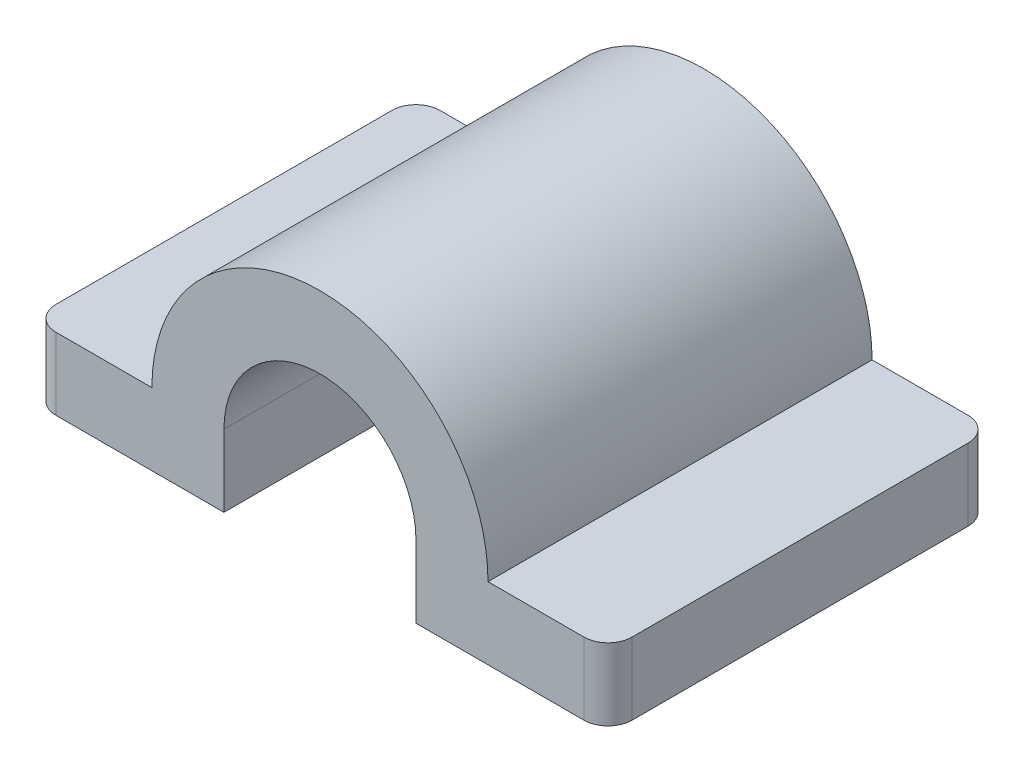
ISO-10303-21;
HEADER;
FILE_DESCRIPTION(('STEP AP214'),'2;1');
FILE_NAME('part.step','',(''),(''),'','','');
FILE_SCHEMA(('AUTOMOTIVE_DESIGN { 1 0 10303 214 1 1 1 1 }'));
ENDSEC;
DATA;
#1=APPLICATION_CONTEXT('core data for automotive mechanical design processes');
#2=APPLICATION_PROTOCOL_DEFINITION('international standard','automotive_design',2000,#1);
#3=PRODUCT_CONTEXT('',#1,'mechanical');
#4=PRODUCT('Part','Part','',(#3));
#5=PRODUCT_RELATED_PRODUCT_CATEGORY('part','',(#4));
#6=PRODUCT_DEFINITION_FORMATION('','',#4);
#7=PRODUCT_DEFINITION_CONTEXT('part definition',#1,'design');
#8=PRODUCT_DEFINITION('design','',#6,#7);
#9=PRODUCT_DEFINITION_SHAPE('','',#8);
#10=(LENGTH_UNIT() NAMED_UNIT(*) SI_UNIT(.MILLI.,.METRE.));
#11=(NAMED_UNIT(*) PLANE_ANGLE_UNIT() SI_UNIT($,.RADIAN.));
#12=(NAMED_UNIT(*) SI_UNIT($,.STERADIAN.) SOLID_ANGLE_UNIT());
#13=UNCERTAINTY_MEASURE_WITH_UNIT(LENGTH_MEASURE(1.E-05),#10,'distance_accuracy_value','');
#14=(GEOMETRIC_REPRESENTATION_CONTEXT(3) GLOBAL_UNCERTAINTY_ASSIGNED_CONTEXT((#13)) GLOBAL_UNIT_ASSIGNED_CONTEXT((#10,
#11,#12)) REPRESENTATION_CONTEXT('',''));
#15=CARTESIAN_POINT('',(0.,0.,0.));
#16=DIRECTION('',(0.,0.,1.));
#17=DIRECTION('',(1.,0.,0.));
#18=AXIS2_PLACEMENT_3D('',#15,#16,#17);
#19=CARTESIAN_POINT('',(-60.,15.,-80.));
#20=DIRECTION('',(-1.,0.,0.));
#21=DIRECTION('',(0.,0.,1.));
#22=AXIS2_PLACEMENT_3D('',#19,#20,#21);
#23=PLANE('',#22);
#24=DIRECTION('',(0.,0.,1.));
#25=VECTOR('',#24,1.);
#26=CARTESIAN_POINT('',(-60.,15.,-80.));
#27=LINE('',#26,#25);
#28=CARTESIAN_POINT('',(-60.,15.,-75.));
#29=VERTEX_POINT('',#28);
#30=CARTESIAN_POINT('',(-60.,15.,-5.));
#31=VERTEX_POINT('',#30);
#32=EDGE_CURVE('E194',#29,#31,#27,.T.);
#33=ORIENTED_EDGE('',*,*,#32,.F.);
#34=DIRECTION('',(0.,-1.,0.));
#35=VECTOR('',#34,1.);
#36=CARTESIAN_POINT('',(-60.,15.,-75.));
#37=LINE('',#36,#35);
#38=CARTESIAN_POINT('',(-60.,0.,-75.));
#39=VERTEX_POINT('',#38);
#40=EDGE_CURVE('E239',#29,#39,#37,.T.);
#41=ORIENTED_EDGE('',*,*,#40,.T.);
#42=DIRECTION('',(0.,0.,1.));
#43=VECTOR('',#42,1.);
#44=CARTESIAN_POINT('',(-60.,0.,-80.));
#45=LINE('',#44,#43);
#46=CARTESIAN_POINT('',(-60.,0.,-5.));
#47=VERTEX_POINT('',#46);
#48=EDGE_CURVE('E150',#39,#47,#45,.T.);
#49=ORIENTED_EDGE('',*,*,#48,.T.);
#50=DIRECTION('',(0.,-1.,0.));
#51=VECTOR('',#50,1.);
#52=CARTESIAN_POINT('',(-60.,15.,-5.));
#53=LINE('',#52,#51);
#54=EDGE_CURVE('E237',#47,#31,#53,.F.);
#55=ORIENTED_EDGE('',*,*,#54,.T.);
#56=EDGE_LOOP('',(#33,#41,#49,#55));
#57=FACE_BOUND('',#56,.T.);
#58=ADVANCED_FACE('F33',(#57),#23,.T.);
#59=CARTESIAN_POINT('',(-60.,15.,-80.));
#60=DIRECTION('',(0.,1.,0.));
#61=DIRECTION('',(0.,0.,1.));
#62=AXIS2_PLACEMENT_3D('',#59,#60,#61);
#63=PLANE('',#62);
#64=DIRECTION('',(-1.,0.,0.));
#65=VECTOR('',#64,1.);
#66=CARTESIAN_POINT('',(-60.,15.,-80.));
#67=LINE('',#66,#65);
#68=CARTESIAN_POINT('',(-35.,15.,-80.));
#69=VERTEX_POINT('',#68);
#70=CARTESIAN_POINT('',(-55.,15.,-80.));
#71=VERTEX_POINT('',#70);
#72=EDGE_CURVE('E172',#69,#71,#67,.T.);
#73=ORIENTED_EDGE('',*,*,#72,.T.);
#74=CARTESIAN_POINT('',(-55.,15.,-75.));
#75=DIRECTION('',(0.,1.,0.));
#76=DIRECTION('',(0.,0.,1.));
#77=AXIS2_PLACEMENT_3D('',#74,#75,#76);
#78=CIRCLE('',#77,5.);
#79=EDGE_CURVE('E11',#71,#29,#78,.T.);
#80=ORIENTED_EDGE('',*,*,#79,.T.);
#81=ORIENTED_EDGE('',*,*,#32,.T.);
#82=CARTESIAN_POINT('',(-55.,15.,-5.));
#83=DIRECTION('',(0.,1.,0.));
#84=DIRECTION('',(0.,0.,1.));
#85=AXIS2_PLACEMENT_3D('',#82,#83,#84);
#86=CIRCLE('',#85,5.);
#87=CARTESIAN_POINT('',(-55.,15.,0.));
#88=VERTEX_POINT('',#87);
#89=EDGE_CURVE('E41',#31,#88,#86,.T.);
#90=ORIENTED_EDGE('',*,*,#89,.T.);
#91=DIRECTION('',(-1.,0.,0.));
#92=VECTOR('',#91,1.);
#93=CARTESIAN_POINT('',(-60.,15.,0.));
#94=LINE('',#93,#92);
#95=CARTESIAN_POINT('',(-35.,15.,0.));
#96=VERTEX_POINT('',#95);
#97=EDGE_CURVE('E142',#96,#88,#94,.T.);
#98=ORIENTED_EDGE('',*,*,#97,.F.);
#99=DIRECTION('',(0.,0.,1.));
#100=VECTOR('',#99,1.);
#101=CARTESIAN_POINT('',(-35.,15.,-80.));
#102=LINE('',#101,#100);
#103=EDGE_CURVE('E198',#69,#96,#102,.T.);
#104=ORIENTED_EDGE('',*,*,#103,.F.);
#105=EDGE_LOOP('',(#73,#80,#81,#90,#98,#104));
#106=FACE_BOUND('',#105,.T.);
#107=ADVANCED_FACE('F245',(#106),#63,.T.);
#108=CARTESIAN_POINT('',(0.,15.,-80.));
#109=DIRECTION('',(0.,0.,1.));
#110=DIRECTION('',(1.,0.,0.));
#111=AXIS2_PLACEMENT_3D('',#108,#109,#110);
#112=CYLINDRICAL_SURFACE('',#111,35.);
#113=CARTESIAN_POINT('',(0.,15.,0.));
#114=DIRECTION('',(0.,0.,1.));
#115=DIRECTION('',(-1.,0.,0.));
#116=AXIS2_PLACEMENT_3D('',#113,#114,#115);
#117=CIRCLE('',#116,35.);
#118=CARTESIAN_POINT('',(35.,15.,0.));
#119=VERTEX_POINT('',#118);
#120=EDGE_CURVE('E189',#119,#96,#117,.T.);
#121=ORIENTED_EDGE('',*,*,#120,.F.);
#122=DIRECTION('',(0.,0.,1.));
#123=VECTOR('',#122,1.);
#124=CARTESIAN_POINT('',(35.,15.,-80.));
#125=LINE('',#124,#123);
#126=CARTESIAN_POINT('',(35.,15.,-80.));
#127=VERTEX_POINT('',#126);
#128=EDGE_CURVE('E200',#127,#119,#125,.T.);
#129=ORIENTED_EDGE('',*,*,#128,.F.);
#130=CARTESIAN_POINT('',(0.,15.,-80.));
#131=DIRECTION('',(0.,0.,1.));
#132=DIRECTION('',(-1.,0.,0.));
#133=AXIS2_PLACEMENT_3D('',#130,#131,#132);
#134=CIRCLE('',#133,35.);
#135=EDGE_CURVE('E169',#127,#69,#134,.T.);
#136=ORIENTED_EDGE('',*,*,#135,.T.);
#137=ORIENTED_EDGE('',*,*,#103,.T.);
#138=EDGE_LOOP('',(#121,#129,#136,#137));
#139=FACE_BOUND('',#138,.T.);
#140=ADVANCED_FACE('F261',(#139),#112,.T.);
#141=CARTESIAN_POINT('',(35.,15.,-80.));
#142=DIRECTION('',(0.,1.,0.));
#143=DIRECTION('',(0.,0.,1.));
#144=AXIS2_PLACEMENT_3D('',#141,#142,#143);
#145=PLANE('',#144);
#146=DIRECTION('',(-1.,0.,0.));
#147=VECTOR('',#146,1.);
#148=CARTESIAN_POINT('',(35.,15.,0.));
#149=LINE('',#148,#147);
#150=CARTESIAN_POINT('',(55.,15.,0.));
#151=VERTEX_POINT('',#150);
#152=EDGE_CURVE('E187',#151,#119,#149,.T.);
#153=ORIENTED_EDGE('',*,*,#152,.F.);
#154=CARTESIAN_POINT('',(55.,15.,-5.));
#155=DIRECTION('',(0.,1.,0.));
#156=DIRECTION('',(0.,0.,1.));
#157=AXIS2_PLACEMENT_3D('',#154,#155,#156);
#158=CIRCLE('',#157,5.);
#159=CARTESIAN_POINT('',(60.,15.,-5.));
#160=VERTEX_POINT('',#159);
#161=EDGE_CURVE('E222',#151,#160,#158,.T.);
#162=ORIENTED_EDGE('',*,*,#161,.T.);
#163=DIRECTION('',(0.,0.,1.));
#164=VECTOR('',#163,1.);
#165=CARTESIAN_POINT('',(60.,15.,-80.));
#166=LINE('',#165,#164);
#167=CARTESIAN_POINT('',(60.,15.,-75.));
#168=VERTEX_POINT('',#167);
#169=EDGE_CURVE('E203',#168,#160,#166,.T.);
#170=ORIENTED_EDGE('',*,*,#169,.F.);
#171=CARTESIAN_POINT('',(55.,15.,-75.));
#172=DIRECTION('',(0.,1.,0.));
#173=DIRECTION('',(0.,0.,1.));
#174=AXIS2_PLACEMENT_3D('',#171,#172,#173);
#175=CIRCLE('',#174,5.);
#176=CARTESIAN_POINT('',(55.,15.,-80.));
#177=VERTEX_POINT('',#176);
#178=EDGE_CURVE('E220',#168,#177,#175,.T.);
#179=ORIENTED_EDGE('',*,*,#178,.T.);
#180=DIRECTION('',(-1.,0.,0.));
#181=VECTOR('',#180,1.);
#182=CARTESIAN_POINT('',(35.,15.,-80.));
#183=LINE('',#182,#181);
#184=EDGE_CURVE('E167',#177,#127,#183,.T.);
#185=ORIENTED_EDGE('',*,*,#184,.T.);
#186=ORIENTED_EDGE('',*,*,#128,.T.);
#187=EDGE_LOOP('',(#153,#162,#170,#179,#185,#186));
#188=FACE_BOUND('',#187,.T.);
#189=ADVANCED_FACE('F264',(#188),#145,.T.);
#190=CARTESIAN_POINT('',(60.,15.,-80.));
#191=DIRECTION('',(1.,0.,0.));
#192=DIRECTION('',(0.,0.,-1.));
#193=AXIS2_PLACEMENT_3D('',#190,#191,#192);
#194=PLANE('',#193);
#195=ORIENTED_EDGE('',*,*,#169,.T.);
#196=DIRECTION('',(0.,1.,0.));
#197=VECTOR('',#196,1.);
#198=CARTESIAN_POINT('',(60.,0.,-5.));
#199=LINE('',#198,#197);
#200=CARTESIAN_POINT('',(60.,0.,-5.));
#201=VERTEX_POINT('',#200);
#202=EDGE_CURVE('E227',#160,#201,#199,.F.);
#203=ORIENTED_EDGE('',*,*,#202,.T.);
#204=DIRECTION('',(0.,0.,1.));
#205=VECTOR('',#204,1.);
#206=CARTESIAN_POINT('',(60.,0.,-80.));
#207=LINE('',#206,#205);
#208=CARTESIAN_POINT('',(60.,0.,-75.));
#209=VERTEX_POINT('',#208);
#210=EDGE_CURVE('E206',#209,#201,#207,.T.);
#211=ORIENTED_EDGE('',*,*,#210,.F.);
#212=DIRECTION('',(0.,1.,0.));
#213=VECTOR('',#212,1.);
#214=CARTESIAN_POINT('',(60.,15.,-75.));
#215=LINE('',#214,#213);
#216=EDGE_CURVE('E224',#209,#168,#215,.T.);
#217=ORIENTED_EDGE('',*,*,#216,.T.);
#218=EDGE_LOOP('',(#195,#203,#211,#217));
#219=FACE_BOUND('',#218,.T.);
#220=ADVANCED_FACE('F272',(#219),#194,.T.);
#221=CARTESIAN_POINT('',(20.,0.,-80.));
#222=DIRECTION('',(0.,-1.,0.));
#223=DIRECTION('',(0.,0.,-1.));
#224=AXIS2_PLACEMENT_3D('',#221,#222,#223);
#225=PLANE('',#224);
#226=ORIENTED_EDGE('',*,*,#210,.T.);
#227=CARTESIAN_POINT('',(55.,0.,-5.));
#228=DIRECTION('',(0.,-1.,0.));
#229=DIRECTION('',(0.,0.,-1.));
#230=AXIS2_PLACEMENT_3D('',#227,#228,#229);
#231=CIRCLE('',#230,5.);
#232=CARTESIAN_POINT('',(55.,0.,0.));
#233=VERTEX_POINT('',#232);
#234=EDGE_CURVE('E231',#201,#233,#231,.T.);
#235=ORIENTED_EDGE('',*,*,#234,.T.);
#236=DIRECTION('',(1.,0.,0.));
#237=VECTOR('',#236,1.);
#238=CARTESIAN_POINT('',(20.,0.,0.));
#239=LINE('',#238,#237);
#240=CARTESIAN_POINT('',(20.,0.,0.));
#241=VERTEX_POINT('',#240);
#242=EDGE_CURVE('E184',#241,#233,#239,.T.);
#243=ORIENTED_EDGE('',*,*,#242,.F.);
#244=DIRECTION('',(0.,0.,1.));
#245=VECTOR('',#244,1.);
#246=CARTESIAN_POINT('',(20.,0.,-80.));
#247=LINE('',#246,#245);
#248=CARTESIAN_POINT('',(20.,0.,-80.));
#249=VERTEX_POINT('',#248);
#250=EDGE_CURVE('E209',#249,#241,#247,.T.);
#251=ORIENTED_EDGE('',*,*,#250,.F.);
#252=DIRECTION('',(1.,0.,0.));
#253=VECTOR('',#252,1.);
#254=CARTESIAN_POINT('',(20.,0.,-80.));
#255=LINE('',#254,#253);
#256=CARTESIAN_POINT('',(55.,0.,-80.));
#257=VERTEX_POINT('',#256);
#258=EDGE_CURVE('E164',#249,#257,#255,.T.);
#259=ORIENTED_EDGE('',*,*,#258,.T.);
#260=CARTESIAN_POINT('',(55.,0.,-75.));
#261=DIRECTION('',(0.,-1.,0.));
#262=DIRECTION('',(0.,0.,-1.));
#263=AXIS2_PLACEMENT_3D('',#260,#261,#262);
#264=CIRCLE('',#263,5.);
#265=EDGE_CURVE('E229',#257,#209,#264,.T.);
#266=ORIENTED_EDGE('',*,*,#265,.T.);
#267=EDGE_LOOP('',(#226,#235,#243,#251,#259,#266));
#268=FACE_BOUND('',#267,.T.);
#269=ADVANCED_FACE('F276',(#268),#225,.T.);
#270=CARTESIAN_POINT('',(20.,15.,-80.));
#271=DIRECTION('',(-1.,0.,0.));
#272=DIRECTION('',(0.,0.,1.));
#273=AXIS2_PLACEMENT_3D('',#270,#271,#272);
#274=PLANE('',#273);
#275=DIRECTION('',(0.,-1.,0.));
#276=VECTOR('',#275,1.);
#277=CARTESIAN_POINT('',(20.,15.,0.));
#278=LINE('',#277,#276);
#279=CARTESIAN_POINT('',(20.,15.,0.));
#280=VERTEX_POINT('',#279);
#281=EDGE_CURVE('E181',#280,#241,#278,.T.);
#282=ORIENTED_EDGE('',*,*,#281,.F.);
#283=DIRECTION('',(0.,0.,1.));
#284=VECTOR('',#283,1.);
#285=CARTESIAN_POINT('',(20.,15.,-80.));
#286=LINE('',#285,#284);
#287=CARTESIAN_POINT('',(20.,15.,-80.));
#288=VERTEX_POINT('',#287);
#289=EDGE_CURVE('E211',#288,#280,#286,.T.);
#290=ORIENTED_EDGE('',*,*,#289,.F.);
#291=DIRECTION('',(0.,-1.,0.));
#292=VECTOR('',#291,1.);
#293=CARTESIAN_POINT('',(20.,15.,-80.));
#294=LINE('',#293,#292);
#295=EDGE_CURVE('E159',#288,#249,#294,.T.);
#296=ORIENTED_EDGE('',*,*,#295,.T.);
#297=ORIENTED_EDGE('',*,*,#250,.T.);
#298=EDGE_LOOP('',(#282,#290,#296,#297));
#299=FACE_BOUND('',#298,.T.);
#300=ADVANCED_FACE('F284',(#299),#274,.T.);
#301=CARTESIAN_POINT('',(0.,15.,-80.));
#302=DIRECTION('',(0.,0.,1.));
#303=DIRECTION('',(1.,0.,0.));
#304=AXIS2_PLACEMENT_3D('',#301,#302,#303);
#305=CYLINDRICAL_SURFACE('',#304,20.);
#306=CARTESIAN_POINT('',(0.,15.,0.));
#307=DIRECTION('',(0.,0.,-1.));
#308=DIRECTION('',(-1.,0.,0.));
#309=AXIS2_PLACEMENT_3D('',#306,#307,#308);
#310=CIRCLE('',#309,20.);
#311=CARTESIAN_POINT('',(-20.,15.,0.));
#312=VERTEX_POINT('',#311);
#313=EDGE_CURVE('E178',#312,#280,#310,.T.);
#314=ORIENTED_EDGE('',*,*,#313,.F.);
#315=DIRECTION('',(0.,0.,1.));
#316=VECTOR('',#315,1.);
#317=CARTESIAN_POINT('',(-20.,15.,-80.));
#318=LINE('',#317,#316);
#319=CARTESIAN_POINT('',(-20.,15.,-80.));
#320=VERTEX_POINT('',#319);
#321=EDGE_CURVE('E149',#320,#312,#318,.T.);
#322=ORIENTED_EDGE('',*,*,#321,.F.);
#323=CARTESIAN_POINT('',(0.,15.,-80.));
#324=DIRECTION('',(0.,0.,-1.));
#325=DIRECTION('',(-1.,0.,0.));
#326=AXIS2_PLACEMENT_3D('',#323,#324,#325);
#327=CIRCLE('',#326,20.);
#328=EDGE_CURVE('E157',#320,#288,#327,.T.);
#329=ORIENTED_EDGE('',*,*,#328,.T.);
#330=ORIENTED_EDGE('',*,*,#289,.T.);
#331=EDGE_LOOP('',(#314,#322,#329,#330));
#332=FACE_BOUND('',#331,.T.);
#333=ADVANCED_FACE('F287',(#332),#305,.F.);
#334=CARTESIAN_POINT('',(-20.,0.,-80.));
#335=DIRECTION('',(1.,0.,0.));
#336=DIRECTION('',(0.,1.,0.));
#337=AXIS2_PLACEMENT_3D('',#334,#335,#336);
#338=PLANE('',#337);
#339=DIRECTION('',(0.,1.,0.));
#340=VECTOR('',#339,1.);
#341=CARTESIAN_POINT('',(-20.,0.,0.));
#342=LINE('',#341,#340);
#343=CARTESIAN_POINT('',(-20.,0.,0.));
#344=VERTEX_POINT('',#343);
#345=EDGE_CURVE('E148',#344,#312,#342,.T.);
#346=ORIENTED_EDGE('',*,*,#345,.F.);
#347=DIRECTION('',(0.,0.,1.));
#348=VECTOR('',#347,1.);
#349=CARTESIAN_POINT('',(-20.,0.,-80.));
#350=LINE('',#349,#348);
#351=CARTESIAN_POINT('',(-20.,0.,-80.));
#352=VERTEX_POINT('',#351);
#353=EDGE_CURVE('E137',#352,#344,#350,.T.);
#354=ORIENTED_EDGE('',*,*,#353,.F.);
#355=DIRECTION('',(0.,1.,0.));
#356=VECTOR('',#355,1.);
#357=CARTESIAN_POINT('',(-20.,0.,-80.));
#358=LINE('',#357,#356);
#359=EDGE_CURVE('E141',#352,#320,#358,.T.);
#360=ORIENTED_EDGE('',*,*,#359,.T.);
#361=ORIENTED_EDGE('',*,*,#321,.T.);
#362=EDGE_LOOP('',(#346,#354,#360,#361));
#363=FACE_BOUND('',#362,.T.);
#364=ADVANCED_FACE('F146',(#363),#338,.T.);
#365=CARTESIAN_POINT('',(-60.,0.,-80.));
#366=DIRECTION('',(0.,-1.,0.));
#367=DIRECTION('',(0.,0.,-1.));
#368=AXIS2_PLACEMENT_3D('',#365,#366,#367);
#369=PLANE('',#368);
#370=ORIENTED_EDGE('',*,*,#48,.F.);
#371=CARTESIAN_POINT('',(-55.,0.,-75.));
#372=DIRECTION('',(0.,-1.,0.));
#373=DIRECTION('',(0.,0.,-1.));
#374=AXIS2_PLACEMENT_3D('',#371,#372,#373);
#375=CIRCLE('',#374,5.);
#376=CARTESIAN_POINT('',(-55.,0.,-80.));
#377=VERTEX_POINT('',#376);
#378=EDGE_CURVE('E56',#39,#377,#375,.T.);
#379=ORIENTED_EDGE('',*,*,#378,.T.);
#380=DIRECTION('',(1.,0.,0.));
#381=VECTOR('',#380,1.);
#382=CARTESIAN_POINT('',(-60.,0.,-80.));
#383=LINE('',#382,#381);
#384=EDGE_CURVE('E134',#377,#352,#383,.T.);
#385=ORIENTED_EDGE('',*,*,#384,.T.);
#386=ORIENTED_EDGE('',*,*,#353,.T.);
#387=DIRECTION('',(1.,0.,0.));
#388=VECTOR('',#387,1.);
#389=CARTESIAN_POINT('',(-60.,0.,0.));
#390=LINE('',#389,#388);
#391=CARTESIAN_POINT('',(-55.,0.,0.));
#392=VERTEX_POINT('',#391);
#393=EDGE_CURVE('E175',#392,#344,#390,.T.);
#394=ORIENTED_EDGE('',*,*,#393,.F.);
#395=CARTESIAN_POINT('',(-55.,0.,-5.));
#396=DIRECTION('',(0.,-1.,0.));
#397=DIRECTION('',(0.,0.,-1.));
#398=AXIS2_PLACEMENT_3D('',#395,#396,#397);
#399=CIRCLE('',#398,5.);
#400=EDGE_CURVE('E48',#392,#47,#399,.T.);
#401=ORIENTED_EDGE('',*,*,#400,.T.);
#402=EDGE_LOOP('',(#370,#379,#385,#386,#394,#401));
#403=FACE_BOUND('',#402,.T.);
#404=ADVANCED_FACE('F136',(#403),#369,.T.);
#405=CARTESIAN_POINT('',(0.,15.,-80.));
#406=DIRECTION('',(0.,0.,-1.));
#407=DIRECTION('',(-1.,0.,0.));
#408=AXIS2_PLACEMENT_3D('',#405,#406,#407);
#409=PLANE('',#408);
#410=ORIENTED_EDGE('',*,*,#184,.F.);
#411=DIRECTION('',(0.,1.,0.));
#412=VECTOR('',#411,1.);
#413=CARTESIAN_POINT('',(55.,15.,-80.));
#414=LINE('',#413,#412);
#415=EDGE_CURVE('E235',#177,#257,#414,.F.);
#416=ORIENTED_EDGE('',*,*,#415,.T.);
#417=ORIENTED_EDGE('',*,*,#258,.F.);
#418=ORIENTED_EDGE('',*,*,#295,.F.);
#419=ORIENTED_EDGE('',*,*,#328,.F.);
#420=ORIENTED_EDGE('',*,*,#359,.F.);
#421=ORIENTED_EDGE('',*,*,#384,.F.);
#422=DIRECTION('',(0.,-1.,0.));
#423=VECTOR('',#422,1.);
#424=CARTESIAN_POINT('',(-55.,15.,-80.));
#425=LINE('',#424,#423);
#426=EDGE_CURVE('E233',#377,#71,#425,.F.);
#427=ORIENTED_EDGE('',*,*,#426,.T.);
#428=ORIENTED_EDGE('',*,*,#72,.F.);
#429=ORIENTED_EDGE('',*,*,#135,.F.);
#430=EDGE_LOOP('',(#410,#416,#417,#418,#419,#420,#421,#427,#428,#429));
#431=FACE_BOUND('',#430,.T.);
#432=ADVANCED_FACE('F154',(#431),#409,.T.);
#433=CARTESIAN_POINT('',(0.,15.,0.));
#434=DIRECTION('',(0.,0.,-1.));
#435=DIRECTION('',(-1.,0.,0.));
#436=AXIS2_PLACEMENT_3D('',#433,#434,#435);
#437=PLANE('',#436);
#438=ORIENTED_EDGE('',*,*,#242,.T.);
#439=DIRECTION('',(0.,1.,0.));
#440=VECTOR('',#439,1.);
#441=CARTESIAN_POINT('',(55.,15.,0.));
#442=LINE('',#441,#440);
#443=EDGE_CURVE('E217',#233,#151,#442,.T.);
#444=ORIENTED_EDGE('',*,*,#443,.T.);
#445=ORIENTED_EDGE('',*,*,#152,.T.);
#446=ORIENTED_EDGE('',*,*,#120,.T.);
#447=ORIENTED_EDGE('',*,*,#97,.T.);
#448=DIRECTION('',(0.,-1.,0.));
#449=VECTOR('',#448,1.);
#450=CARTESIAN_POINT('',(-55.,0.,0.));
#451=LINE('',#450,#449);
#452=EDGE_CURVE('E197',#88,#392,#451,.T.);
#453=ORIENTED_EDGE('',*,*,#452,.T.);
#454=ORIENTED_EDGE('',*,*,#393,.T.);
#455=ORIENTED_EDGE('',*,*,#345,.T.);
#456=ORIENTED_EDGE('',*,*,#313,.T.);
#457=ORIENTED_EDGE('',*,*,#281,.T.);
#458=EDGE_LOOP('',(#438,#444,#445,#446,#447,#453,#454,#455,#456,#457));
#459=FACE_BOUND('',#458,.T.);
#460=ADVANCED_FACE('F251',(#459),#437,.F.);
#461=CARTESIAN_POINT('',(55.,15.,-5.));
#462=DIRECTION('',(0.,-1.,0.));
#463=DIRECTION('',(0.,0.,-1.));
#464=AXIS2_PLACEMENT_3D('',#461,#462,#463);
#465=CYLINDRICAL_SURFACE('',#464,5.);
#466=ORIENTED_EDGE('',*,*,#234,.F.);
#467=ORIENTED_EDGE('',*,*,#202,.F.);
#468=ORIENTED_EDGE('',*,*,#161,.F.);
#469=ORIENTED_EDGE('',*,*,#443,.F.);
#470=EDGE_LOOP('',(#466,#467,#468,#469));
#471=FACE_BOUND('',#470,.T.);
#472=ADVANCED_FACE('F280',(#471),#465,.T.);
#473=CARTESIAN_POINT('',(55.,15.,-75.));
#474=DIRECTION('',(0.,1.,0.));
#475=DIRECTION('',(0.,0.,1.));
#476=AXIS2_PLACEMENT_3D('',#473,#474,#475);
#477=CYLINDRICAL_SURFACE('',#476,5.);
#478=ORIENTED_EDGE('',*,*,#265,.F.);
#479=ORIENTED_EDGE('',*,*,#415,.F.);
#480=ORIENTED_EDGE('',*,*,#178,.F.);
#481=ORIENTED_EDGE('',*,*,#216,.F.);
#482=EDGE_LOOP('',(#478,#479,#480,#481));
#483=FACE_BOUND('',#482,.T.);
#484=ADVANCED_FACE('F269',(#483),#477,.T.);
#485=CARTESIAN_POINT('',(-55.,15.,-75.));
#486=DIRECTION('',(0.,-1.,0.));
#487=DIRECTION('',(0.,0.,-1.));
#488=AXIS2_PLACEMENT_3D('',#485,#486,#487);
#489=CYLINDRICAL_SURFACE('',#488,5.);
#490=ORIENTED_EDGE('',*,*,#79,.F.);
#491=ORIENTED_EDGE('',*,*,#426,.F.);
#492=ORIENTED_EDGE('',*,*,#378,.F.);
#493=ORIENTED_EDGE('',*,*,#40,.F.);
#494=EDGE_LOOP('',(#490,#491,#492,#493));
#495=FACE_BOUND('',#494,.T.);
#496=ADVANCED_FACE('F255',(#495),#489,.T.);
#497=CARTESIAN_POINT('',(-55.,15.,-5.));
#498=DIRECTION('',(0.,1.,0.));
#499=DIRECTION('',(0.,0.,1.));
#500=AXIS2_PLACEMENT_3D('',#497,#498,#499);
#501=CYLINDRICAL_SURFACE('',#500,5.);
#502=ORIENTED_EDGE('',*,*,#89,.F.);
#503=ORIENTED_EDGE('',*,*,#54,.F.);
#504=ORIENTED_EDGE('',*,*,#400,.F.);
#505=ORIENTED_EDGE('',*,*,#452,.F.);
#506=EDGE_LOOP('',(#502,#503,#504,#505));
#507=FACE_BOUND('',#506,.T.);
#508=ADVANCED_FACE('F35',(#507),#501,.T.);
#509=CLOSED_SHELL('',(#58,#107,#140,#189,#220,#269,#300,#333,#364,#404,#432,#460,#472,#484,#496,#508));
#510=MANIFOLD_SOLID_BREP('B2',#509);
#511=ADVANCED_BREP_SHAPE_REPRESENTATION('',(#18,#510),#14);
#512=SHAPE_DEFINITION_REPRESENTATION(#9,#511);
ENDSEC;
END-ISO-10303-21;
